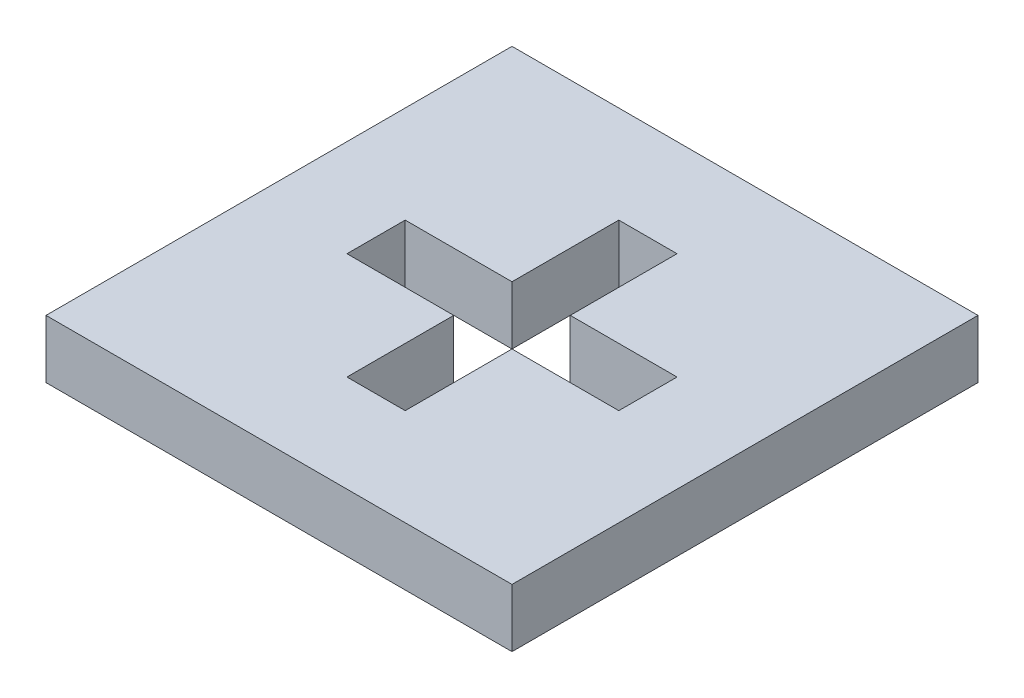
ISO-10303-21;
HEADER;
FILE_DESCRIPTION(('STEP AP214'),'2;1');
FILE_NAME('part.step','',(''),(''),'','','');
FILE_SCHEMA(('AUTOMOTIVE_DESIGN { 1 0 10303 214 1 1 1 1 }'));
ENDSEC;
DATA;
#1=APPLICATION_CONTEXT('core data for automotive mechanical design processes');
#2=APPLICATION_PROTOCOL_DEFINITION('international standard','automotive_design',2000,#1);
#3=PRODUCT_CONTEXT('',#1,'mechanical');
#4=PRODUCT('Part','Part','',(#3));
#5=PRODUCT_RELATED_PRODUCT_CATEGORY('part','',(#4));
#6=PRODUCT_DEFINITION_FORMATION('','',#4);
#7=PRODUCT_DEFINITION_CONTEXT('part definition',#1,'design');
#8=PRODUCT_DEFINITION('design','',#6,#7);
#9=PRODUCT_DEFINITION_SHAPE('','',#8);
#10=(LENGTH_UNIT() NAMED_UNIT(*) SI_UNIT(.MILLI.,.METRE.));
#11=(NAMED_UNIT(*) PLANE_ANGLE_UNIT() SI_UNIT($,.RADIAN.));
#12=(NAMED_UNIT(*) SI_UNIT($,.STERADIAN.) SOLID_ANGLE_UNIT());
#13=UNCERTAINTY_MEASURE_WITH_UNIT(LENGTH_MEASURE(1.E-05),#10,'distance_accuracy_value','');
#14=(GEOMETRIC_REPRESENTATION_CONTEXT(3) GLOBAL_UNCERTAINTY_ASSIGNED_CONTEXT((#13)) GLOBAL_UNIT_ASSIGNED_CONTEXT((#10,
#11,#12)) REPRESENTATION_CONTEXT('',''));
#15=CARTESIAN_POINT('',(0.,0.,0.));
#16=DIRECTION('',(0.,0.,1.));
#17=DIRECTION('',(1.,0.,0.));
#18=AXIS2_PLACEMENT_3D('',#15,#16,#17);
#19=CARTESIAN_POINT('',(0.,6.35,0.));
#20=DIRECTION('',(1.,0.,0.));
#21=DIRECTION('',(0.,0.,-1.));
#22=AXIS2_PLACEMENT_3D('',#19,#20,#21);
#23=PLANE('',#22);
#24=DIRECTION('',(0.,0.,1.));
#25=VECTOR('',#24,1.);
#26=CARTESIAN_POINT('',(0.,0.,0.));
#27=LINE('',#26,#25);
#28=CARTESIAN_POINT('',(0.,0.,-50.8));
#29=VERTEX_POINT('',#28);
#30=CARTESIAN_POINT('',(0.,0.,0.));
#31=VERTEX_POINT('',#30);
#32=EDGE_CURVE('E226',#29,#31,#27,.T.);
#33=ORIENTED_EDGE('',*,*,#32,.T.);
#34=DIRECTION('',(0.,-1.,0.));
#35=VECTOR('',#34,1.);
#36=CARTESIAN_POINT('',(0.,6.35,0.));
#37=LINE('',#36,#35);
#38=CARTESIAN_POINT('',(0.,6.35,0.));
#39=VERTEX_POINT('',#38);
#40=EDGE_CURVE('E11',#39,#31,#37,.T.);
#41=ORIENTED_EDGE('',*,*,#40,.F.);
#42=DIRECTION('',(0.,0.,1.));
#43=VECTOR('',#42,1.);
#44=CARTESIAN_POINT('',(0.,6.35,0.));
#45=LINE('',#44,#43);
#46=CARTESIAN_POINT('',(0.,6.35,-50.8));
#47=VERTEX_POINT('',#46);
#48=EDGE_CURVE('E246',#47,#39,#45,.T.);
#49=ORIENTED_EDGE('',*,*,#48,.F.);
#50=DIRECTION('',(0.,-1.,0.));
#51=VECTOR('',#50,1.);
#52=CARTESIAN_POINT('',(0.,6.35,-50.8));
#53=LINE('',#52,#51);
#54=EDGE_CURVE('E256',#47,#29,#53,.T.);
#55=ORIENTED_EDGE('',*,*,#54,.T.);
#56=EDGE_LOOP('',(#33,#41,#49,#55));
#57=FACE_BOUND('',#56,.T.);
#58=ADVANCED_FACE('F33',(#57),#23,.F.);
#59=CARTESIAN_POINT('',(0.,6.35,0.));
#60=DIRECTION('',(0.,0.,-1.));
#61=DIRECTION('',(-1.,0.,0.));
#62=AXIS2_PLACEMENT_3D('',#59,#60,#61);
#63=PLANE('',#62);
#64=DIRECTION('',(1.,0.,0.));
#65=VECTOR('',#64,1.);
#66=CARTESIAN_POINT('',(0.,0.,0.));
#67=LINE('',#66,#65);
#68=CARTESIAN_POINT('',(50.8,0.,0.));
#69=VERTEX_POINT('',#68);
#70=EDGE_CURVE('E259',#31,#69,#67,.T.);
#71=ORIENTED_EDGE('',*,*,#70,.T.);
#72=DIRECTION('',(0.,-1.,0.));
#73=VECTOR('',#72,1.);
#74=CARTESIAN_POINT('',(50.8,6.35,0.));
#75=LINE('',#74,#73);
#76=CARTESIAN_POINT('',(50.8,6.35,0.));
#77=VERTEX_POINT('',#76);
#78=EDGE_CURVE('E40',#77,#69,#75,.T.);
#79=ORIENTED_EDGE('',*,*,#78,.F.);
#80=DIRECTION('',(1.,0.,0.));
#81=VECTOR('',#80,1.);
#82=CARTESIAN_POINT('',(0.,6.35,0.));
#83=LINE('',#82,#81);
#84=EDGE_CURVE('E249',#39,#77,#83,.T.);
#85=ORIENTED_EDGE('',*,*,#84,.F.);
#86=ORIENTED_EDGE('',*,*,#40,.T.);
#87=EDGE_LOOP('',(#71,#79,#85,#86));
#88=FACE_BOUND('',#87,.T.);
#89=ADVANCED_FACE('F287',(#88),#63,.F.);
#90=CARTESIAN_POINT('',(50.8,6.35,0.));
#91=DIRECTION('',(-1.,0.,0.));
#92=DIRECTION('',(0.,0.,1.));
#93=AXIS2_PLACEMENT_3D('',#90,#91,#92);
#94=PLANE('',#93);
#95=DIRECTION('',(0.,0.,-1.));
#96=VECTOR('',#95,1.);
#97=CARTESIAN_POINT('',(50.8,0.,0.));
#98=LINE('',#97,#96);
#99=CARTESIAN_POINT('',(50.8,0.,-50.8));
#100=VERTEX_POINT('',#99);
#101=EDGE_CURVE('E261',#69,#100,#98,.T.);
#102=ORIENTED_EDGE('',*,*,#101,.T.);
#103=DIRECTION('',(0.,-1.,0.));
#104=VECTOR('',#103,1.);
#105=CARTESIAN_POINT('',(50.8,6.35,-50.8));
#106=LINE('',#105,#104);
#107=CARTESIAN_POINT('',(50.8,6.35,-50.8));
#108=VERTEX_POINT('',#107);
#109=EDGE_CURVE('E266',#108,#100,#106,.T.);
#110=ORIENTED_EDGE('',*,*,#109,.F.);
#111=DIRECTION('',(0.,0.,-1.));
#112=VECTOR('',#111,1.);
#113=CARTESIAN_POINT('',(50.8,6.35,0.));
#114=LINE('',#113,#112);
#115=EDGE_CURVE('E252',#77,#108,#114,.T.);
#116=ORIENTED_EDGE('',*,*,#115,.F.);
#117=ORIENTED_EDGE('',*,*,#78,.T.);
#118=EDGE_LOOP('',(#102,#110,#116,#117));
#119=FACE_BOUND('',#118,.T.);
#120=ADVANCED_FACE('F273',(#119),#94,.F.);
#121=CARTESIAN_POINT('',(0.,6.35,-50.8));
#122=DIRECTION('',(0.,0.,1.));
#123=DIRECTION('',(1.,0.,0.));
#124=AXIS2_PLACEMENT_3D('',#121,#122,#123);
#125=PLANE('',#124);
#126=DIRECTION('',(-1.,0.,0.));
#127=VECTOR('',#126,1.);
#128=CARTESIAN_POINT('',(0.,0.,-50.8));
#129=LINE('',#128,#127);
#130=EDGE_CURVE('E250',#100,#29,#129,.T.);
#131=ORIENTED_EDGE('',*,*,#130,.T.);
#132=ORIENTED_EDGE('',*,*,#54,.F.);
#133=DIRECTION('',(-1.,0.,0.));
#134=VECTOR('',#133,1.);
#135=CARTESIAN_POINT('',(0.,6.35,-50.8));
#136=LINE('',#135,#134);
#137=EDGE_CURVE('E254',#108,#47,#136,.T.);
#138=ORIENTED_EDGE('',*,*,#137,.F.);
#139=ORIENTED_EDGE('',*,*,#109,.T.);
#140=EDGE_LOOP('',(#131,#132,#138,#139));
#141=FACE_BOUND('',#140,.T.);
#142=ADVANCED_FACE('F280',(#141),#125,.F.);
#143=CARTESIAN_POINT('',(0.,6.35,0.));
#144=DIRECTION('',(0.,-1.,0.));
#145=DIRECTION('',(0.,0.,-1.));
#146=AXIS2_PLACEMENT_3D('',#143,#144,#145);
#147=PLANE('',#146);
#148=DIRECTION('',(-1.,0.,0.));
#149=VECTOR('',#148,1.);
#150=CARTESIAN_POINT('',(10.5833333333333,6.35,-28.575));
#151=LINE('',#150,#149);
#152=CARTESIAN_POINT('',(22.225,6.35,-28.575));
#153=VERTEX_POINT('',#152);
#154=CARTESIAN_POINT('',(10.5833333333333,6.35,-28.575));
#155=VERTEX_POINT('',#154);
#156=EDGE_CURVE('E196',#153,#155,#151,.T.);
#157=ORIENTED_EDGE('',*,*,#156,.F.);
#158=DIRECTION('',(0.,0.,1.));
#159=VECTOR('',#158,1.);
#160=CARTESIAN_POINT('',(22.225,6.35,-40.2166666666666));
#161=LINE('',#160,#159);
#162=CARTESIAN_POINT('',(22.225,6.35,-40.2166666666666));
#163=VERTEX_POINT('',#162);
#164=EDGE_CURVE('E47',#163,#153,#161,.T.);
#165=ORIENTED_EDGE('',*,*,#164,.F.);
#166=DIRECTION('',(-1.,0.,0.));
#167=VECTOR('',#166,1.);
#168=CARTESIAN_POINT('',(22.225,6.35,-40.2166666666666));
#169=LINE('',#168,#167);
#170=CARTESIAN_POINT('',(28.575,6.35,-40.2166666666666));
#171=VERTEX_POINT('',#170);
#172=EDGE_CURVE('E164',#171,#163,#169,.T.);
#173=ORIENTED_EDGE('',*,*,#172,.F.);
#174=DIRECTION('',(0.,0.,-1.));
#175=VECTOR('',#174,1.);
#176=CARTESIAN_POINT('',(28.575,6.35,-40.2166666666666));
#177=LINE('',#176,#175);
#178=CARTESIAN_POINT('',(28.575,6.35,-28.575));
#179=VERTEX_POINT('',#178);
#180=EDGE_CURVE('E167',#179,#171,#177,.T.);
#181=ORIENTED_EDGE('',*,*,#180,.F.);
#182=DIRECTION('',(-1.,0.,0.));
#183=VECTOR('',#182,1.);
#184=CARTESIAN_POINT('',(28.575,6.35,-28.575));
#185=LINE('',#184,#183);
#186=CARTESIAN_POINT('',(40.2166666666667,6.35,-28.575));
#187=VERTEX_POINT('',#186);
#188=EDGE_CURVE('E219',#187,#179,#185,.T.);
#189=ORIENTED_EDGE('',*,*,#188,.F.);
#190=DIRECTION('',(0.,0.,-1.));
#191=VECTOR('',#190,1.);
#192=CARTESIAN_POINT('',(40.2166666666667,6.35,-28.575));
#193=LINE('',#192,#191);
#194=CARTESIAN_POINT('',(40.2166666666667,6.35,-22.225));
#195=VERTEX_POINT('',#194);
#196=EDGE_CURVE('E216',#195,#187,#193,.T.);
#197=ORIENTED_EDGE('',*,*,#196,.F.);
#198=DIRECTION('',(1.,0.,0.));
#199=VECTOR('',#198,1.);
#200=CARTESIAN_POINT('',(28.575,6.35,-22.225));
#201=LINE('',#200,#199);
#202=CARTESIAN_POINT('',(28.575,6.35,-22.225));
#203=VERTEX_POINT('',#202);
#204=EDGE_CURVE('E213',#203,#195,#201,.T.);
#205=ORIENTED_EDGE('',*,*,#204,.F.);
#206=DIRECTION('',(0.,0.,-1.));
#207=VECTOR('',#206,1.);
#208=CARTESIAN_POINT('',(28.575,6.35,-22.225));
#209=LINE('',#208,#207);
#210=CARTESIAN_POINT('',(28.575,6.35,-10.5833333333333));
#211=VERTEX_POINT('',#210);
#212=EDGE_CURVE('E210',#211,#203,#209,.T.);
#213=ORIENTED_EDGE('',*,*,#212,.F.);
#214=DIRECTION('',(1.,0.,0.));
#215=VECTOR('',#214,1.);
#216=CARTESIAN_POINT('',(22.225,6.35,-10.5833333333333));
#217=LINE('',#216,#215);
#218=CARTESIAN_POINT('',(22.225,6.35,-10.5833333333333));
#219=VERTEX_POINT('',#218);
#220=EDGE_CURVE('E207',#219,#211,#217,.T.);
#221=ORIENTED_EDGE('',*,*,#220,.F.);
#222=DIRECTION('',(0.,0.,1.));
#223=VECTOR('',#222,1.);
#224=CARTESIAN_POINT('',(22.225,6.35,-22.225));
#225=LINE('',#224,#223);
#226=CARTESIAN_POINT('',(22.225,6.35,-22.225));
#227=VERTEX_POINT('',#226);
#228=EDGE_CURVE('E204',#227,#219,#225,.T.);
#229=ORIENTED_EDGE('',*,*,#228,.F.);
#230=DIRECTION('',(1.,0.,0.));
#231=VECTOR('',#230,1.);
#232=CARTESIAN_POINT('',(10.5833333333333,6.35,-22.225));
#233=LINE('',#232,#231);
#234=CARTESIAN_POINT('',(10.5833333333333,6.35,-22.225));
#235=VERTEX_POINT('',#234);
#236=EDGE_CURVE('E201',#235,#227,#233,.T.);
#237=ORIENTED_EDGE('',*,*,#236,.F.);
#238=DIRECTION('',(0.,0.,1.));
#239=VECTOR('',#238,1.);
#240=CARTESIAN_POINT('',(10.5833333333333,6.35,-28.575));
#241=LINE('',#240,#239);
#242=EDGE_CURVE('E198',#155,#235,#241,.T.);
#243=ORIENTED_EDGE('',*,*,#242,.F.);
#244=EDGE_LOOP('',(#157,#165,#173,#181,#189,#197,#205,#213,#221,#229,#237,#243));
#245=FACE_BOUND('',#244,.T.);
#246=ORIENTED_EDGE('',*,*,#48,.T.);
#247=ORIENTED_EDGE('',*,*,#84,.T.);
#248=ORIENTED_EDGE('',*,*,#115,.T.);
#249=ORIENTED_EDGE('',*,*,#137,.T.);
#250=EDGE_LOOP('',(#246,#247,#248,#249));
#251=FACE_BOUND('',#250,.T.);
#252=ADVANCED_FACE('F286',(#245,#251),#147,.F.);
#253=CARTESIAN_POINT('',(0.,0.,0.));
#254=DIRECTION('',(0.,-1.,0.));
#255=DIRECTION('',(0.,0.,-1.));
#256=AXIS2_PLACEMENT_3D('',#253,#254,#255);
#257=PLANE('',#256);
#258=DIRECTION('',(0.,0.,1.));
#259=VECTOR('',#258,1.);
#260=CARTESIAN_POINT('',(22.225,0.,-40.2166666666666));
#261=LINE('',#260,#259);
#262=CARTESIAN_POINT('',(22.225,0.,-40.2166666666666));
#263=VERTEX_POINT('',#262);
#264=CARTESIAN_POINT('',(22.225,0.,-28.575));
#265=VERTEX_POINT('',#264);
#266=EDGE_CURVE('E147',#263,#265,#261,.T.);
#267=ORIENTED_EDGE('',*,*,#266,.T.);
#268=DIRECTION('',(-1.,0.,0.));
#269=VECTOR('',#268,1.);
#270=CARTESIAN_POINT('',(10.5833333333333,0.,-28.575));
#271=LINE('',#270,#269);
#272=CARTESIAN_POINT('',(10.5833333333333,0.,-28.575));
#273=VERTEX_POINT('',#272);
#274=EDGE_CURVE('E156',#265,#273,#271,.T.);
#275=ORIENTED_EDGE('',*,*,#274,.T.);
#276=DIRECTION('',(0.,0.,1.));
#277=VECTOR('',#276,1.);
#278=CARTESIAN_POINT('',(10.5833333333333,0.,-28.575));
#279=LINE('',#278,#277);
#280=CARTESIAN_POINT('',(10.5833333333333,0.,-22.225));
#281=VERTEX_POINT('',#280);
#282=EDGE_CURVE('E55',#273,#281,#279,.T.);
#283=ORIENTED_EDGE('',*,*,#282,.T.);
#284=DIRECTION('',(1.,0.,0.));
#285=VECTOR('',#284,1.);
#286=CARTESIAN_POINT('',(10.5833333333333,0.,-22.225));
#287=LINE('',#286,#285);
#288=CARTESIAN_POINT('',(22.225,0.,-22.225));
#289=VERTEX_POINT('',#288);
#290=EDGE_CURVE('E171',#281,#289,#287,.T.);
#291=ORIENTED_EDGE('',*,*,#290,.T.);
#292=DIRECTION('',(0.,0.,1.));
#293=VECTOR('',#292,1.);
#294=CARTESIAN_POINT('',(22.225,0.,-22.225));
#295=LINE('',#294,#293);
#296=CARTESIAN_POINT('',(22.225,0.,-10.5833333333333));
#297=VERTEX_POINT('',#296);
#298=EDGE_CURVE('E174',#289,#297,#295,.T.);
#299=ORIENTED_EDGE('',*,*,#298,.T.);
#300=DIRECTION('',(1.,0.,0.));
#301=VECTOR('',#300,1.);
#302=CARTESIAN_POINT('',(22.225,0.,-10.5833333333333));
#303=LINE('',#302,#301);
#304=CARTESIAN_POINT('',(28.575,0.,-10.5833333333333));
#305=VERTEX_POINT('',#304);
#306=EDGE_CURVE('E177',#297,#305,#303,.T.);
#307=ORIENTED_EDGE('',*,*,#306,.T.);
#308=DIRECTION('',(0.,0.,-1.));
#309=VECTOR('',#308,1.);
#310=CARTESIAN_POINT('',(28.575,0.,-22.225));
#311=LINE('',#310,#309);
#312=CARTESIAN_POINT('',(28.575,0.,-22.225));
#313=VERTEX_POINT('',#312);
#314=EDGE_CURVE('E180',#305,#313,#311,.T.);
#315=ORIENTED_EDGE('',*,*,#314,.T.);
#316=DIRECTION('',(1.,0.,0.));
#317=VECTOR('',#316,1.);
#318=CARTESIAN_POINT('',(28.575,0.,-22.225));
#319=LINE('',#318,#317);
#320=CARTESIAN_POINT('',(40.2166666666667,0.,-22.225));
#321=VERTEX_POINT('',#320);
#322=EDGE_CURVE('E183',#313,#321,#319,.T.);
#323=ORIENTED_EDGE('',*,*,#322,.T.);
#324=DIRECTION('',(0.,0.,-1.));
#325=VECTOR('',#324,1.);
#326=CARTESIAN_POINT('',(40.2166666666667,0.,-28.575));
#327=LINE('',#326,#325);
#328=CARTESIAN_POINT('',(40.2166666666667,0.,-28.575));
#329=VERTEX_POINT('',#328);
#330=EDGE_CURVE('E186',#321,#329,#327,.T.);
#331=ORIENTED_EDGE('',*,*,#330,.T.);
#332=DIRECTION('',(-1.,0.,0.));
#333=VECTOR('',#332,1.);
#334=CARTESIAN_POINT('',(28.575,0.,-28.575));
#335=LINE('',#334,#333);
#336=CARTESIAN_POINT('',(28.575,0.,-28.575));
#337=VERTEX_POINT('',#336);
#338=EDGE_CURVE('E189',#329,#337,#335,.T.);
#339=ORIENTED_EDGE('',*,*,#338,.T.);
#340=DIRECTION('',(0.,0.,-1.));
#341=VECTOR('',#340,1.);
#342=CARTESIAN_POINT('',(28.575,0.,-40.2166666666666));
#343=LINE('',#342,#341);
#344=CARTESIAN_POINT('',(28.575,0.,-40.2166666666666));
#345=VERTEX_POINT('',#344);
#346=EDGE_CURVE('E192',#337,#345,#343,.T.);
#347=ORIENTED_EDGE('',*,*,#346,.T.);
#348=DIRECTION('',(-1.,0.,0.));
#349=VECTOR('',#348,1.);
#350=CARTESIAN_POINT('',(22.225,0.,-40.2166666666666));
#351=LINE('',#350,#349);
#352=EDGE_CURVE('E153',#345,#263,#351,.T.);
#353=ORIENTED_EDGE('',*,*,#352,.T.);
#354=EDGE_LOOP('',(#267,#275,#283,#291,#299,#307,#315,#323,#331,#339,#347,#353));
#355=FACE_BOUND('',#354,.T.);
#356=ORIENTED_EDGE('',*,*,#32,.F.);
#357=ORIENTED_EDGE('',*,*,#130,.F.);
#358=ORIENTED_EDGE('',*,*,#101,.F.);
#359=ORIENTED_EDGE('',*,*,#70,.F.);
#360=EDGE_LOOP('',(#356,#357,#358,#359));
#361=FACE_BOUND('',#360,.T.);
#362=ADVANCED_FACE('F160',(#355,#361),#257,.T.);
#363=CARTESIAN_POINT('',(22.225,0.,-40.2166666666666));
#364=DIRECTION('',(-1.,0.,0.));
#365=DIRECTION('',(0.,0.,1.));
#366=AXIS2_PLACEMENT_3D('',#363,#364,#365);
#367=PLANE('',#366);
#368=ORIENTED_EDGE('',*,*,#164,.T.);
#369=DIRECTION('',(0.,1.,0.));
#370=VECTOR('',#369,1.);
#371=CARTESIAN_POINT('',(22.225,0.,-28.575));
#372=LINE('',#371,#370);
#373=EDGE_CURVE('E143',#265,#153,#372,.T.);
#374=ORIENTED_EDGE('',*,*,#373,.F.);
#375=ORIENTED_EDGE('',*,*,#266,.F.);
#376=DIRECTION('',(0.,1.,0.));
#377=VECTOR('',#376,1.);
#378=CARTESIAN_POINT('',(22.225,0.,-40.2166666666666));
#379=LINE('',#378,#377);
#380=EDGE_CURVE('E224',#263,#163,#379,.T.);
#381=ORIENTED_EDGE('',*,*,#380,.T.);
#382=EDGE_LOOP('',(#368,#374,#375,#381));
#383=FACE_BOUND('',#382,.T.);
#384=ADVANCED_FACE('F145',(#383),#367,.F.);
#385=CARTESIAN_POINT('',(22.225,0.,-40.2166666666666));
#386=DIRECTION('',(0.,0.,-1.));
#387=DIRECTION('',(-1.,0.,0.));
#388=AXIS2_PLACEMENT_3D('',#385,#386,#387);
#389=PLANE('',#388);
#390=ORIENTED_EDGE('',*,*,#172,.T.);
#391=ORIENTED_EDGE('',*,*,#380,.F.);
#392=ORIENTED_EDGE('',*,*,#352,.F.);
#393=DIRECTION('',(0.,1.,0.));
#394=VECTOR('',#393,1.);
#395=CARTESIAN_POINT('',(28.575,0.,-40.2166666666666));
#396=LINE('',#395,#394);
#397=EDGE_CURVE('E227',#345,#171,#396,.T.);
#398=ORIENTED_EDGE('',*,*,#397,.T.);
#399=EDGE_LOOP('',(#390,#391,#392,#398));
#400=FACE_BOUND('',#399,.T.);
#401=ADVANCED_FACE('F304',(#400),#389,.F.);
#402=CARTESIAN_POINT('',(28.575,0.,-40.2166666666666));
#403=DIRECTION('',(1.,0.,0.));
#404=DIRECTION('',(0.,0.,-1.));
#405=AXIS2_PLACEMENT_3D('',#402,#403,#404);
#406=PLANE('',#405);
#407=ORIENTED_EDGE('',*,*,#180,.T.);
#408=ORIENTED_EDGE('',*,*,#397,.F.);
#409=ORIENTED_EDGE('',*,*,#346,.F.);
#410=DIRECTION('',(0.,1.,0.));
#411=VECTOR('',#410,1.);
#412=CARTESIAN_POINT('',(28.575,0.,-28.575));
#413=LINE('',#412,#411);
#414=EDGE_CURVE('E229',#337,#179,#413,.T.);
#415=ORIENTED_EDGE('',*,*,#414,.T.);
#416=EDGE_LOOP('',(#407,#408,#409,#415));
#417=FACE_BOUND('',#416,.T.);
#418=ADVANCED_FACE('F337',(#417),#406,.F.);
#419=CARTESIAN_POINT('',(28.575,0.,-28.575));
#420=DIRECTION('',(0.,0.,-1.));
#421=DIRECTION('',(-1.,0.,0.));
#422=AXIS2_PLACEMENT_3D('',#419,#420,#421);
#423=PLANE('',#422);
#424=ORIENTED_EDGE('',*,*,#188,.T.);
#425=ORIENTED_EDGE('',*,*,#414,.F.);
#426=ORIENTED_EDGE('',*,*,#338,.F.);
#427=DIRECTION('',(0.,1.,0.));
#428=VECTOR('',#427,1.);
#429=CARTESIAN_POINT('',(40.2166666666667,0.,-28.575));
#430=LINE('',#429,#428);
#431=EDGE_CURVE('E231',#329,#187,#430,.T.);
#432=ORIENTED_EDGE('',*,*,#431,.T.);
#433=EDGE_LOOP('',(#424,#425,#426,#432));
#434=FACE_BOUND('',#433,.T.);
#435=ADVANCED_FACE('F333',(#434),#423,.F.);
#436=CARTESIAN_POINT('',(40.2166666666667,0.,-28.575));
#437=DIRECTION('',(1.,0.,0.));
#438=DIRECTION('',(0.,0.,-1.));
#439=AXIS2_PLACEMENT_3D('',#436,#437,#438);
#440=PLANE('',#439);
#441=ORIENTED_EDGE('',*,*,#196,.T.);
#442=ORIENTED_EDGE('',*,*,#431,.F.);
#443=ORIENTED_EDGE('',*,*,#330,.F.);
#444=DIRECTION('',(0.,1.,0.));
#445=VECTOR('',#444,1.);
#446=CARTESIAN_POINT('',(40.2166666666667,0.,-22.225));
#447=LINE('',#446,#445);
#448=EDGE_CURVE('E233',#321,#195,#447,.T.);
#449=ORIENTED_EDGE('',*,*,#448,.T.);
#450=EDGE_LOOP('',(#441,#442,#443,#449));
#451=FACE_BOUND('',#450,.T.);
#452=ADVANCED_FACE('F329',(#451),#440,.F.);
#453=CARTESIAN_POINT('',(28.575,0.,-22.225));
#454=DIRECTION('',(0.,0.,1.));
#455=DIRECTION('',(1.,0.,0.));
#456=AXIS2_PLACEMENT_3D('',#453,#454,#455);
#457=PLANE('',#456);
#458=ORIENTED_EDGE('',*,*,#204,.T.);
#459=ORIENTED_EDGE('',*,*,#448,.F.);
#460=ORIENTED_EDGE('',*,*,#322,.F.);
#461=DIRECTION('',(0.,1.,0.));
#462=VECTOR('',#461,1.);
#463=CARTESIAN_POINT('',(28.575,0.,-22.225));
#464=LINE('',#463,#462);
#465=EDGE_CURVE('E235',#313,#203,#464,.T.);
#466=ORIENTED_EDGE('',*,*,#465,.T.);
#467=EDGE_LOOP('',(#458,#459,#460,#466));
#468=FACE_BOUND('',#467,.T.);
#469=ADVANCED_FACE('F325',(#468),#457,.F.);
#470=CARTESIAN_POINT('',(28.575,0.,-22.225));
#471=DIRECTION('',(1.,0.,0.));
#472=DIRECTION('',(0.,0.,-1.));
#473=AXIS2_PLACEMENT_3D('',#470,#471,#472);
#474=PLANE('',#473);
#475=ORIENTED_EDGE('',*,*,#212,.T.);
#476=ORIENTED_EDGE('',*,*,#465,.F.);
#477=ORIENTED_EDGE('',*,*,#314,.F.);
#478=DIRECTION('',(0.,1.,0.));
#479=VECTOR('',#478,1.);
#480=CARTESIAN_POINT('',(28.575,0.,-10.5833333333333));
#481=LINE('',#480,#479);
#482=EDGE_CURVE('E237',#305,#211,#481,.T.);
#483=ORIENTED_EDGE('',*,*,#482,.T.);
#484=EDGE_LOOP('',(#475,#476,#477,#483));
#485=FACE_BOUND('',#484,.T.);
#486=ADVANCED_FACE('F321',(#485),#474,.F.);
#487=CARTESIAN_POINT('',(22.225,0.,-10.5833333333333));
#488=DIRECTION('',(0.,0.,1.));
#489=DIRECTION('',(1.,0.,0.));
#490=AXIS2_PLACEMENT_3D('',#487,#488,#489);
#491=PLANE('',#490);
#492=ORIENTED_EDGE('',*,*,#220,.T.);
#493=ORIENTED_EDGE('',*,*,#482,.F.);
#494=ORIENTED_EDGE('',*,*,#306,.F.);
#495=DIRECTION('',(0.,1.,0.));
#496=VECTOR('',#495,1.);
#497=CARTESIAN_POINT('',(22.225,0.,-10.5833333333333));
#498=LINE('',#497,#496);
#499=EDGE_CURVE('E239',#297,#219,#498,.T.);
#500=ORIENTED_EDGE('',*,*,#499,.T.);
#501=EDGE_LOOP('',(#492,#493,#494,#500));
#502=FACE_BOUND('',#501,.T.);
#503=ADVANCED_FACE('F317',(#502),#491,.F.);
#504=CARTESIAN_POINT('',(22.225,0.,-22.225));
#505=DIRECTION('',(-1.,0.,0.));
#506=DIRECTION('',(0.,0.,1.));
#507=AXIS2_PLACEMENT_3D('',#504,#505,#506);
#508=PLANE('',#507);
#509=ORIENTED_EDGE('',*,*,#228,.T.);
#510=ORIENTED_EDGE('',*,*,#499,.F.);
#511=ORIENTED_EDGE('',*,*,#298,.F.);
#512=DIRECTION('',(0.,1.,0.));
#513=VECTOR('',#512,1.);
#514=CARTESIAN_POINT('',(22.225,0.,-22.225));
#515=LINE('',#514,#513);
#516=EDGE_CURVE('E241',#289,#227,#515,.T.);
#517=ORIENTED_EDGE('',*,*,#516,.T.);
#518=EDGE_LOOP('',(#509,#510,#511,#517));
#519=FACE_BOUND('',#518,.T.);
#520=ADVANCED_FACE('F313',(#519),#508,.F.);
#521=CARTESIAN_POINT('',(10.5833333333333,0.,-22.225));
#522=DIRECTION('',(0.,0.,1.));
#523=DIRECTION('',(1.,0.,0.));
#524=AXIS2_PLACEMENT_3D('',#521,#522,#523);
#525=PLANE('',#524);
#526=ORIENTED_EDGE('',*,*,#236,.T.);
#527=ORIENTED_EDGE('',*,*,#516,.F.);
#528=ORIENTED_EDGE('',*,*,#290,.F.);
#529=DIRECTION('',(0.,1.,0.));
#530=VECTOR('',#529,1.);
#531=CARTESIAN_POINT('',(10.5833333333333,0.,-22.225));
#532=LINE('',#531,#530);
#533=EDGE_CURVE('E243',#281,#235,#532,.T.);
#534=ORIENTED_EDGE('',*,*,#533,.T.);
#535=EDGE_LOOP('',(#526,#527,#528,#534));
#536=FACE_BOUND('',#535,.T.);
#537=ADVANCED_FACE('F310',(#536),#525,.F.);
#538=CARTESIAN_POINT('',(10.5833333333333,0.,-28.575));
#539=DIRECTION('',(-1.,0.,0.));
#540=DIRECTION('',(0.,0.,1.));
#541=AXIS2_PLACEMENT_3D('',#538,#539,#540);
#542=PLANE('',#541);
#543=ORIENTED_EDGE('',*,*,#242,.T.);
#544=ORIENTED_EDGE('',*,*,#533,.F.);
#545=ORIENTED_EDGE('',*,*,#282,.F.);
#546=DIRECTION('',(0.,1.,0.));
#547=VECTOR('',#546,1.);
#548=CARTESIAN_POINT('',(10.5833333333333,0.,-28.575));
#549=LINE('',#548,#547);
#550=EDGE_CURVE('E152',#273,#155,#549,.T.);
#551=ORIENTED_EDGE('',*,*,#550,.T.);
#552=EDGE_LOOP('',(#543,#544,#545,#551));
#553=FACE_BOUND('',#552,.T.);
#554=ADVANCED_FACE('F307',(#553),#542,.F.);
#555=CARTESIAN_POINT('',(10.5833333333333,0.,-28.575));
#556=DIRECTION('',(0.,0.,-1.));
#557=DIRECTION('',(-1.,0.,0.));
#558=AXIS2_PLACEMENT_3D('',#555,#556,#557);
#559=PLANE('',#558);
#560=ORIENTED_EDGE('',*,*,#156,.T.);
#561=ORIENTED_EDGE('',*,*,#550,.F.);
#562=ORIENTED_EDGE('',*,*,#274,.F.);
#563=ORIENTED_EDGE('',*,*,#373,.T.);
#564=EDGE_LOOP('',(#560,#561,#562,#563));
#565=FACE_BOUND('',#564,.T.);
#566=ADVANCED_FACE('F157',(#565),#559,.F.);
#567=CLOSED_SHELL('',(#58,#89,#120,#142,#252,#362,#384,#401,#418,#435,#452,#469,#486,#503,#520,
#537,#554,#566));
#568=MANIFOLD_SOLID_BREP('B2',#567);
#569=ADVANCED_BREP_SHAPE_REPRESENTATION('',(#18,#568),#14);
#570=SHAPE_DEFINITION_REPRESENTATION(#9,#569);
ENDSEC;
END-ISO-10303-21;
